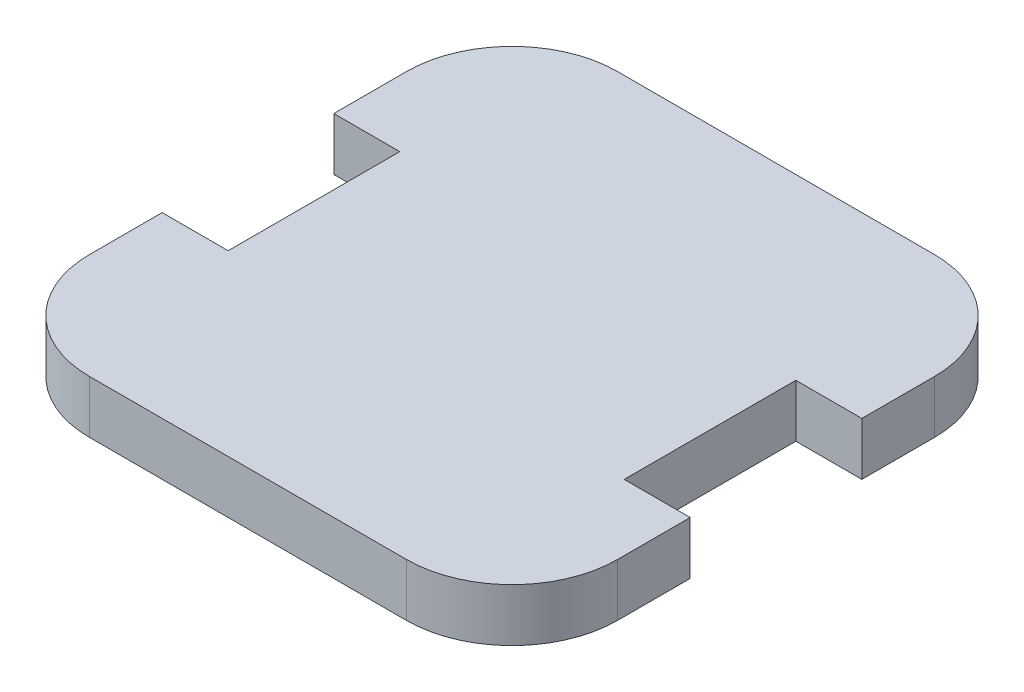
ISO-10303-21;
HEADER;
FILE_DESCRIPTION(('STEP AP214'),'2;1');
FILE_NAME('part.step','',(''),(''),'','','');
FILE_SCHEMA(('AUTOMOTIVE_DESIGN { 1 0 10303 214 1 1 1 1 }'));
ENDSEC;
DATA;
#1=APPLICATION_CONTEXT('core data for automotive mechanical design processes');
#2=APPLICATION_PROTOCOL_DEFINITION('international standard','automotive_design',2000,#1);
#3=PRODUCT_CONTEXT('',#1,'mechanical');
#4=PRODUCT('Part','Part','',(#3));
#5=PRODUCT_RELATED_PRODUCT_CATEGORY('part','',(#4));
#6=PRODUCT_DEFINITION_FORMATION('','',#4);
#7=PRODUCT_DEFINITION_CONTEXT('part definition',#1,'design');
#8=PRODUCT_DEFINITION('design','',#6,#7);
#9=PRODUCT_DEFINITION_SHAPE('','',#8);
#10=(LENGTH_UNIT() NAMED_UNIT(*) SI_UNIT(.MILLI.,.METRE.));
#11=(NAMED_UNIT(*) PLANE_ANGLE_UNIT() SI_UNIT($,.RADIAN.));
#12=(NAMED_UNIT(*) SI_UNIT($,.STERADIAN.) SOLID_ANGLE_UNIT());
#13=UNCERTAINTY_MEASURE_WITH_UNIT(LENGTH_MEASURE(1.E-05),#10,'distance_accuracy_value','');
#14=(GEOMETRIC_REPRESENTATION_CONTEXT(3) GLOBAL_UNCERTAINTY_ASSIGNED_CONTEXT((#13)) GLOBAL_UNIT_ASSIGNED_CONTEXT((#10,
#11,#12)) REPRESENTATION_CONTEXT('',''));
#15=CARTESIAN_POINT('',(0.,0.,0.));
#16=DIRECTION('',(0.,0.,1.));
#17=DIRECTION('',(1.,0.,0.));
#18=AXIS2_PLACEMENT_3D('',#15,#16,#17);
#19=CARTESIAN_POINT('',(-25.4,5.08,25.4));
#20=DIRECTION('',(1.,0.,0.));
#21=DIRECTION('',(0.,0.,-1.));
#22=AXIS2_PLACEMENT_3D('',#19,#20,#21);
#23=PLANE('',#22);
#24=DIRECTION('',(0.,1.,0.));
#25=VECTOR('',#24,1.);
#26=CARTESIAN_POINT('',(-25.4,0.,-8.255));
#27=LINE('',#26,#25);
#28=CARTESIAN_POINT('',(-25.4,0.,-8.255));
#29=VERTEX_POINT('',#28);
#30=CARTESIAN_POINT('',(-25.4,5.08,-8.255));
#31=VERTEX_POINT('',#30);
#32=EDGE_CURVE('E236',#29,#31,#27,.T.);
#33=ORIENTED_EDGE('',*,*,#32,.T.);
#34=DIRECTION('',(0.,0.,1.));
#35=VECTOR('',#34,1.);
#36=CARTESIAN_POINT('',(-25.4,5.08,25.4));
#37=LINE('',#36,#35);
#38=CARTESIAN_POINT('',(-25.4,5.08,-15.24));
#39=VERTEX_POINT('',#38);
#40=EDGE_CURVE('E219',#39,#31,#37,.T.);
#41=ORIENTED_EDGE('',*,*,#40,.F.);
#42=DIRECTION('',(0.,-1.,0.));
#43=VECTOR('',#42,1.);
#44=CARTESIAN_POINT('',(-25.4,5.08,-15.24));
#45=LINE('',#44,#43);
#46=CARTESIAN_POINT('',(-25.4,0.,-15.24));
#47=VERTEX_POINT('',#46);
#48=EDGE_CURVE('E41',#39,#47,#45,.T.);
#49=ORIENTED_EDGE('',*,*,#48,.T.);
#50=DIRECTION('',(0.,0.,1.));
#51=VECTOR('',#50,1.);
#52=CARTESIAN_POINT('',(-25.4,0.,25.4));
#53=LINE('',#52,#51);
#54=EDGE_CURVE('E167',#47,#29,#53,.T.);
#55=ORIENTED_EDGE('',*,*,#54,.T.);
#56=EDGE_LOOP('',(#33,#41,#49,#55));
#57=FACE_BOUND('',#56,.T.);
#58=ADVANCED_FACE('F33',(#57),#23,.F.);
#59=DIRECTION('',(0.,1.,0.));
#60=VECTOR('',#59,1.);
#61=CARTESIAN_POINT('',(-25.4,0.,8.255));
#62=LINE('',#61,#60);
#63=CARTESIAN_POINT('',(-25.4,0.,8.255));
#64=VERTEX_POINT('',#63);
#65=CARTESIAN_POINT('',(-25.4,5.08,8.255));
#66=VERTEX_POINT('',#65);
#67=EDGE_CURVE('E147',#64,#66,#62,.T.);
#68=ORIENTED_EDGE('',*,*,#67,.F.);
#69=CARTESIAN_POINT('',(-25.4,0.,15.24));
#70=VERTEX_POINT('',#69);
#71=EDGE_CURVE('E158',#64,#70,#53,.T.);
#72=ORIENTED_EDGE('',*,*,#71,.T.);
#73=DIRECTION('',(0.,-1.,0.));
#74=VECTOR('',#73,1.);
#75=CARTESIAN_POINT('',(-25.4,5.08,15.24));
#76=LINE('',#75,#74);
#77=CARTESIAN_POINT('',(-25.4,5.08,15.24));
#78=VERTEX_POINT('',#77);
#79=EDGE_CURVE('E11',#70,#78,#76,.F.);
#80=ORIENTED_EDGE('',*,*,#79,.T.);
#81=EDGE_CURVE('E160',#66,#78,#37,.T.);
#82=ORIENTED_EDGE('',*,*,#81,.F.);
#83=EDGE_LOOP('',(#68,#72,#80,#82));
#84=FACE_BOUND('',#83,.T.);
#85=ADVANCED_FACE('F157',(#84),#23,.F.);
#86=CARTESIAN_POINT('',(0.,5.08,0.));
#87=DIRECTION('',(0.,-1.,0.));
#88=DIRECTION('',(0.,0.,-1.));
#89=AXIS2_PLACEMENT_3D('',#86,#87,#88);
#90=PLANE('',#89);
#91=DIRECTION('',(1.,0.,0.));
#92=VECTOR('',#91,1.);
#93=CARTESIAN_POINT('',(-19.05,5.08,-8.255));
#94=LINE('',#93,#92);
#95=CARTESIAN_POINT('',(-19.05,5.08,-8.255));
#96=VERTEX_POINT('',#95);
#97=EDGE_CURVE('E153',#31,#96,#94,.T.);
#98=ORIENTED_EDGE('',*,*,#97,.T.);
#99=DIRECTION('',(0.,0.,1.));
#100=VECTOR('',#99,1.);
#101=CARTESIAN_POINT('',(-19.05,5.08,8.255));
#102=LINE('',#101,#100);
#103=CARTESIAN_POINT('',(-19.05,5.08,8.255));
#104=VERTEX_POINT('',#103);
#105=EDGE_CURVE('E231',#96,#104,#102,.T.);
#106=ORIENTED_EDGE('',*,*,#105,.T.);
#107=DIRECTION('',(-1.,0.,0.));
#108=VECTOR('',#107,1.);
#109=CARTESIAN_POINT('',(-19.05,5.08,8.255));
#110=LINE('',#109,#108);
#111=EDGE_CURVE('E229',#104,#66,#110,.T.);
#112=ORIENTED_EDGE('',*,*,#111,.T.);
#113=ORIENTED_EDGE('',*,*,#81,.T.);
#114=CARTESIAN_POINT('',(-15.24,5.08,15.24));
#115=DIRECTION('',(0.,-1.,0.));
#116=DIRECTION('',(0.,0.,-1.));
#117=AXIS2_PLACEMENT_3D('',#114,#115,#116);
#118=CIRCLE('',#117,10.16);
#119=CARTESIAN_POINT('',(-15.24,5.08,25.4));
#120=VERTEX_POINT('',#119);
#121=EDGE_CURVE('E202',#78,#120,#118,.F.);
#122=ORIENTED_EDGE('',*,*,#121,.T.);
#123=DIRECTION('',(1.,0.,0.));
#124=VECTOR('',#123,1.);
#125=CARTESIAN_POINT('',(-25.4,5.08,25.4));
#126=LINE('',#125,#124);
#127=CARTESIAN_POINT('',(15.24,5.08,25.4));
#128=VERTEX_POINT('',#127);
#129=EDGE_CURVE('E183',#120,#128,#126,.T.);
#130=ORIENTED_EDGE('',*,*,#129,.T.);
#131=CARTESIAN_POINT('',(15.24,5.08,15.24));
#132=DIRECTION('',(0.,-1.,0.));
#133=DIRECTION('',(0.,0.,-1.));
#134=AXIS2_PLACEMENT_3D('',#131,#132,#133);
#135=CIRCLE('',#134,10.16);
#136=CARTESIAN_POINT('',(25.4,5.08,15.24));
#137=VERTEX_POINT('',#136);
#138=EDGE_CURVE('E204',#128,#137,#135,.F.);
#139=ORIENTED_EDGE('',*,*,#138,.T.);
#140=DIRECTION('',(0.,0.,-1.));
#141=VECTOR('',#140,1.);
#142=CARTESIAN_POINT('',(25.4,5.08,25.4));
#143=LINE('',#142,#141);
#144=CARTESIAN_POINT('',(25.4,5.08,8.255));
#145=VERTEX_POINT('',#144);
#146=EDGE_CURVE('E266',#137,#145,#143,.T.);
#147=ORIENTED_EDGE('',*,*,#146,.T.);
#148=DIRECTION('',(1.,0.,0.));
#149=VECTOR('',#148,1.);
#150=CARTESIAN_POINT('',(19.05,5.08,8.255));
#151=LINE('',#150,#149);
#152=CARTESIAN_POINT('',(19.05,5.08,8.255));
#153=VERTEX_POINT('',#152);
#154=EDGE_CURVE('E245',#153,#145,#151,.T.);
#155=ORIENTED_EDGE('',*,*,#154,.F.);
#156=DIRECTION('',(0.,0.,1.));
#157=VECTOR('',#156,1.);
#158=CARTESIAN_POINT('',(19.05,5.08,8.255));
#159=LINE('',#158,#157);
#160=CARTESIAN_POINT('',(19.05,5.08,-8.255));
#161=VERTEX_POINT('',#160);
#162=EDGE_CURVE('E253',#161,#153,#159,.T.);
#163=ORIENTED_EDGE('',*,*,#162,.F.);
#164=DIRECTION('',(-1.,0.,0.));
#165=VECTOR('',#164,1.);
#166=CARTESIAN_POINT('',(19.05,5.08,-8.255));
#167=LINE('',#166,#165);
#168=CARTESIAN_POINT('',(25.4,5.08,-8.255));
#169=VERTEX_POINT('',#168);
#170=EDGE_CURVE('E238',#169,#161,#167,.T.);
#171=ORIENTED_EDGE('',*,*,#170,.F.);
#172=CARTESIAN_POINT('',(25.4,5.08,-15.24));
#173=VERTEX_POINT('',#172);
#174=EDGE_CURVE('E179',#169,#173,#143,.T.);
#175=ORIENTED_EDGE('',*,*,#174,.T.);
#176=CARTESIAN_POINT('',(15.24,5.08,-15.24));
#177=DIRECTION('',(0.,-1.,0.));
#178=DIRECTION('',(0.,0.,-1.));
#179=AXIS2_PLACEMENT_3D('',#176,#177,#178);
#180=CIRCLE('',#179,10.16);
#181=CARTESIAN_POINT('',(15.24,5.08,-25.4));
#182=VERTEX_POINT('',#181);
#183=EDGE_CURVE('E206',#173,#182,#180,.F.);
#184=ORIENTED_EDGE('',*,*,#183,.T.);
#185=DIRECTION('',(-1.,0.,0.));
#186=VECTOR('',#185,1.);
#187=CARTESIAN_POINT('',(-25.4,5.08,-25.4));
#188=LINE('',#187,#186);
#189=CARTESIAN_POINT('',(-15.24,5.08,-25.4));
#190=VERTEX_POINT('',#189);
#191=EDGE_CURVE('E269',#182,#190,#188,.T.);
#192=ORIENTED_EDGE('',*,*,#191,.T.);
#193=CARTESIAN_POINT('',(-15.24,5.08,-15.24));
#194=DIRECTION('',(0.,-1.,0.));
#195=DIRECTION('',(0.,0.,-1.));
#196=AXIS2_PLACEMENT_3D('',#193,#194,#195);
#197=CIRCLE('',#196,10.16);
#198=EDGE_CURVE('E200',#190,#39,#197,.F.);
#199=ORIENTED_EDGE('',*,*,#198,.T.);
#200=ORIENTED_EDGE('',*,*,#40,.T.);
#201=EDGE_LOOP('',(#98,#106,#112,#113,#122,#130,#139,#147,#155,#163,#171,#175,#184,#192,#199,#200));
#202=FACE_BOUND('',#201,.T.);
#203=ADVANCED_FACE('F289',(#202),#90,.F.);
#204=CARTESIAN_POINT('',(0.,0.,0.));
#205=DIRECTION('',(0.,-1.,0.));
#206=DIRECTION('',(0.,0.,-1.));
#207=AXIS2_PLACEMENT_3D('',#204,#205,#206);
#208=PLANE('',#207);
#209=DIRECTION('',(0.,0.,1.));
#210=VECTOR('',#209,1.);
#211=CARTESIAN_POINT('',(-19.05,0.,8.255));
#212=LINE('',#211,#210);
#213=CARTESIAN_POINT('',(-19.05,0.,-8.255));
#214=VERTEX_POINT('',#213);
#215=CARTESIAN_POINT('',(-19.05,0.,8.255));
#216=VERTEX_POINT('',#215);
#217=EDGE_CURVE('E152',#214,#216,#212,.T.);
#218=ORIENTED_EDGE('',*,*,#217,.F.);
#219=DIRECTION('',(1.,0.,0.));
#220=VECTOR('',#219,1.);
#221=CARTESIAN_POINT('',(-19.05,0.,-8.255));
#222=LINE('',#221,#220);
#223=EDGE_CURVE('E161',#29,#214,#222,.T.);
#224=ORIENTED_EDGE('',*,*,#223,.F.);
#225=ORIENTED_EDGE('',*,*,#54,.F.);
#226=CARTESIAN_POINT('',(-15.24,0.,-15.24));
#227=DIRECTION('',(0.,-1.,0.));
#228=DIRECTION('',(0.,0.,-1.));
#229=AXIS2_PLACEMENT_3D('',#226,#227,#228);
#230=CIRCLE('',#229,10.16);
#231=CARTESIAN_POINT('',(-15.24,0.,-25.4));
#232=VERTEX_POINT('',#231);
#233=EDGE_CURVE('E186',#47,#232,#230,.T.);
#234=ORIENTED_EDGE('',*,*,#233,.T.);
#235=DIRECTION('',(-1.,0.,0.));
#236=VECTOR('',#235,1.);
#237=CARTESIAN_POINT('',(-25.4,0.,-25.4));
#238=LINE('',#237,#236);
#239=CARTESIAN_POINT('',(15.24,0.,-25.4));
#240=VERTEX_POINT('',#239);
#241=EDGE_CURVE('E168',#240,#232,#238,.T.);
#242=ORIENTED_EDGE('',*,*,#241,.F.);
#243=CARTESIAN_POINT('',(15.24,0.,-15.24));
#244=DIRECTION('',(0.,-1.,0.));
#245=DIRECTION('',(0.,0.,-1.));
#246=AXIS2_PLACEMENT_3D('',#243,#244,#245);
#247=CIRCLE('',#246,10.16);
#248=CARTESIAN_POINT('',(25.4,0.,-15.24));
#249=VERTEX_POINT('',#248);
#250=EDGE_CURVE('E191',#240,#249,#247,.T.);
#251=ORIENTED_EDGE('',*,*,#250,.T.);
#252=DIRECTION('',(0.,0.,-1.));
#253=VECTOR('',#252,1.);
#254=CARTESIAN_POINT('',(25.4,0.,25.4));
#255=LINE('',#254,#253);
#256=CARTESIAN_POINT('',(25.4,0.,-8.255));
#257=VERTEX_POINT('',#256);
#258=EDGE_CURVE('E260',#257,#249,#255,.T.);
#259=ORIENTED_EDGE('',*,*,#258,.F.);
#260=DIRECTION('',(-1.,0.,0.));
#261=VECTOR('',#260,1.);
#262=CARTESIAN_POINT('',(19.05,0.,-8.255));
#263=LINE('',#262,#261);
#264=CARTESIAN_POINT('',(19.05,0.,-8.255));
#265=VERTEX_POINT('',#264);
#266=EDGE_CURVE('E242',#257,#265,#263,.T.);
#267=ORIENTED_EDGE('',*,*,#266,.T.);
#268=DIRECTION('',(0.,0.,1.));
#269=VECTOR('',#268,1.);
#270=CARTESIAN_POINT('',(19.05,0.,8.255));
#271=LINE('',#270,#269);
#272=CARTESIAN_POINT('',(19.05,0.,8.255));
#273=VERTEX_POINT('',#272);
#274=EDGE_CURVE('E56',#265,#273,#271,.T.);
#275=ORIENTED_EDGE('',*,*,#274,.T.);
#276=DIRECTION('',(1.,0.,0.));
#277=VECTOR('',#276,1.);
#278=CARTESIAN_POINT('',(19.05,0.,8.255));
#279=LINE('',#278,#277);
#280=CARTESIAN_POINT('',(25.4,0.,8.255));
#281=VERTEX_POINT('',#280);
#282=EDGE_CURVE('E247',#273,#281,#279,.T.);
#283=ORIENTED_EDGE('',*,*,#282,.T.);
#284=CARTESIAN_POINT('',(25.4,0.,15.24));
#285=VERTEX_POINT('',#284);
#286=EDGE_CURVE('E173',#285,#281,#255,.T.);
#287=ORIENTED_EDGE('',*,*,#286,.F.);
#288=CARTESIAN_POINT('',(15.24,0.,15.24));
#289=DIRECTION('',(0.,-1.,0.));
#290=DIRECTION('',(0.,0.,-1.));
#291=AXIS2_PLACEMENT_3D('',#288,#289,#290);
#292=CIRCLE('',#291,10.16);
#293=CARTESIAN_POINT('',(15.24,0.,25.4));
#294=VERTEX_POINT('',#293);
#295=EDGE_CURVE('E189',#285,#294,#292,.T.);
#296=ORIENTED_EDGE('',*,*,#295,.T.);
#297=DIRECTION('',(1.,0.,0.));
#298=VECTOR('',#297,1.);
#299=CARTESIAN_POINT('',(-25.4,0.,25.4));
#300=LINE('',#299,#298);
#301=CARTESIAN_POINT('',(-15.24,0.,25.4));
#302=VERTEX_POINT('',#301);
#303=EDGE_CURVE('E171',#302,#294,#300,.T.);
#304=ORIENTED_EDGE('',*,*,#303,.F.);
#305=CARTESIAN_POINT('',(-15.24,0.,15.24));
#306=DIRECTION('',(0.,-1.,0.));
#307=DIRECTION('',(0.,0.,-1.));
#308=AXIS2_PLACEMENT_3D('',#305,#306,#307);
#309=CIRCLE('',#308,10.16);
#310=EDGE_CURVE('E165',#302,#70,#309,.T.);
#311=ORIENTED_EDGE('',*,*,#310,.T.);
#312=ORIENTED_EDGE('',*,*,#71,.F.);
#313=DIRECTION('',(-1.,0.,0.));
#314=VECTOR('',#313,1.);
#315=CARTESIAN_POINT('',(-19.05,0.,8.255));
#316=LINE('',#315,#314);
#317=EDGE_CURVE('E144',#216,#64,#316,.T.);
#318=ORIENTED_EDGE('',*,*,#317,.F.);
#319=EDGE_LOOP('',(#218,#224,#225,#234,#242,#251,#259,#267,#275,#283,#287,#296,#304,#311,#312,#318));
#320=FACE_BOUND('',#319,.T.);
#321=ADVANCED_FACE('F163',(#320),#208,.T.);
#322=CARTESIAN_POINT('',(25.4,5.08,25.4));
#323=DIRECTION('',(-1.,0.,0.));
#324=DIRECTION('',(0.,0.,1.));
#325=AXIS2_PLACEMENT_3D('',#322,#323,#324);
#326=PLANE('',#325);
#327=ORIENTED_EDGE('',*,*,#286,.T.);
#328=DIRECTION('',(0.,1.,0.));
#329=VECTOR('',#328,1.);
#330=CARTESIAN_POINT('',(25.4,0.,8.255));
#331=LINE('',#330,#329);
#332=EDGE_CURVE('E257',#281,#145,#331,.T.);
#333=ORIENTED_EDGE('',*,*,#332,.T.);
#334=ORIENTED_EDGE('',*,*,#146,.F.);
#335=DIRECTION('',(0.,-1.,0.));
#336=VECTOR('',#335,1.);
#337=CARTESIAN_POINT('',(25.4,5.08,15.24));
#338=LINE('',#337,#336);
#339=EDGE_CURVE('E194',#137,#285,#338,.T.);
#340=ORIENTED_EDGE('',*,*,#339,.T.);
#341=EDGE_LOOP('',(#327,#333,#334,#340));
#342=FACE_BOUND('',#341,.T.);
#343=ADVANCED_FACE('F311',(#342),#326,.F.);
#344=ORIENTED_EDGE('',*,*,#174,.F.);
#345=DIRECTION('',(0.,1.,0.));
#346=VECTOR('',#345,1.);
#347=CARTESIAN_POINT('',(25.4,0.,-8.255));
#348=LINE('',#347,#346);
#349=EDGE_CURVE('E250',#257,#169,#348,.T.);
#350=ORIENTED_EDGE('',*,*,#349,.F.);
#351=ORIENTED_EDGE('',*,*,#258,.T.);
#352=DIRECTION('',(0.,-1.,0.));
#353=VECTOR('',#352,1.);
#354=CARTESIAN_POINT('',(25.4,5.08,-15.24));
#355=LINE('',#354,#353);
#356=EDGE_CURVE('E197',#249,#173,#355,.F.);
#357=ORIENTED_EDGE('',*,*,#356,.T.);
#358=EDGE_LOOP('',(#344,#350,#351,#357));
#359=FACE_BOUND('',#358,.T.);
#360=ADVANCED_FACE('F281',(#359),#326,.F.);
#361=CARTESIAN_POINT('',(-25.4,5.08,-25.4));
#362=DIRECTION('',(0.,0.,1.));
#363=DIRECTION('',(1.,0.,0.));
#364=AXIS2_PLACEMENT_3D('',#361,#362,#363);
#365=PLANE('',#364);
#366=ORIENTED_EDGE('',*,*,#191,.F.);
#367=DIRECTION('',(0.,-1.,0.));
#368=VECTOR('',#367,1.);
#369=CARTESIAN_POINT('',(15.24,5.08,-25.4));
#370=LINE('',#369,#368);
#371=EDGE_CURVE('E182',#182,#240,#370,.T.);
#372=ORIENTED_EDGE('',*,*,#371,.T.);
#373=ORIENTED_EDGE('',*,*,#241,.T.);
#374=DIRECTION('',(0.,-1.,0.));
#375=VECTOR('',#374,1.);
#376=CARTESIAN_POINT('',(-15.24,5.08,-25.4));
#377=LINE('',#376,#375);
#378=EDGE_CURVE('E180',#232,#190,#377,.F.);
#379=ORIENTED_EDGE('',*,*,#378,.T.);
#380=EDGE_LOOP('',(#366,#372,#373,#379));
#381=FACE_BOUND('',#380,.T.);
#382=ADVANCED_FACE('F292',(#381),#365,.F.);
#383=CARTESIAN_POINT('',(-25.4,5.08,25.4));
#384=DIRECTION('',(0.,0.,-1.));
#385=DIRECTION('',(-1.,0.,0.));
#386=AXIS2_PLACEMENT_3D('',#383,#384,#385);
#387=PLANE('',#386);
#388=ORIENTED_EDGE('',*,*,#303,.T.);
#389=DIRECTION('',(0.,-1.,0.));
#390=VECTOR('',#389,1.);
#391=CARTESIAN_POINT('',(15.24,5.08,25.4));
#392=LINE('',#391,#390);
#393=EDGE_CURVE('E211',#294,#128,#392,.F.);
#394=ORIENTED_EDGE('',*,*,#393,.T.);
#395=ORIENTED_EDGE('',*,*,#129,.F.);
#396=DIRECTION('',(0.,-1.,0.));
#397=VECTOR('',#396,1.);
#398=CARTESIAN_POINT('',(-15.24,5.08,25.4));
#399=LINE('',#398,#397);
#400=EDGE_CURVE('E208',#120,#302,#399,.T.);
#401=ORIENTED_EDGE('',*,*,#400,.T.);
#402=EDGE_LOOP('',(#388,#394,#395,#401));
#403=FACE_BOUND('',#402,.T.);
#404=ADVANCED_FACE('F304',(#403),#387,.F.);
#405=CARTESIAN_POINT('',(15.24,5.08,-15.24));
#406=DIRECTION('',(0.,-1.,0.));
#407=DIRECTION('',(0.,0.,-1.));
#408=AXIS2_PLACEMENT_3D('',#405,#406,#407);
#409=CYLINDRICAL_SURFACE('',#408,10.16);
#410=ORIENTED_EDGE('',*,*,#183,.F.);
#411=ORIENTED_EDGE('',*,*,#356,.F.);
#412=ORIENTED_EDGE('',*,*,#250,.F.);
#413=ORIENTED_EDGE('',*,*,#371,.F.);
#414=EDGE_LOOP('',(#410,#411,#412,#413));
#415=FACE_BOUND('',#414,.T.);
#416=ADVANCED_FACE('F286',(#415),#409,.T.);
#417=CARTESIAN_POINT('',(15.24,5.08,15.24));
#418=DIRECTION('',(0.,-1.,0.));
#419=DIRECTION('',(0.,0.,-1.));
#420=AXIS2_PLACEMENT_3D('',#417,#418,#419);
#421=CYLINDRICAL_SURFACE('',#420,10.16);
#422=ORIENTED_EDGE('',*,*,#138,.F.);
#423=ORIENTED_EDGE('',*,*,#393,.F.);
#424=ORIENTED_EDGE('',*,*,#295,.F.);
#425=ORIENTED_EDGE('',*,*,#339,.F.);
#426=EDGE_LOOP('',(#422,#423,#424,#425));
#427=FACE_BOUND('',#426,.T.);
#428=ADVANCED_FACE('F309',(#427),#421,.T.);
#429=CARTESIAN_POINT('',(-15.24,5.08,15.24));
#430=DIRECTION('',(0.,-1.,0.));
#431=DIRECTION('',(0.,0.,-1.));
#432=AXIS2_PLACEMENT_3D('',#429,#430,#431);
#433=CYLINDRICAL_SURFACE('',#432,10.16);
#434=ORIENTED_EDGE('',*,*,#121,.F.);
#435=ORIENTED_EDGE('',*,*,#79,.F.);
#436=ORIENTED_EDGE('',*,*,#310,.F.);
#437=ORIENTED_EDGE('',*,*,#400,.F.);
#438=EDGE_LOOP('',(#434,#435,#436,#437));
#439=FACE_BOUND('',#438,.T.);
#440=ADVANCED_FACE('F302',(#439),#433,.T.);
#441=CARTESIAN_POINT('',(-15.24,5.08,-15.24));
#442=DIRECTION('',(0.,-1.,0.));
#443=DIRECTION('',(0.,0.,-1.));
#444=AXIS2_PLACEMENT_3D('',#441,#442,#443);
#445=CYLINDRICAL_SURFACE('',#444,10.16);
#446=ORIENTED_EDGE('',*,*,#198,.F.);
#447=ORIENTED_EDGE('',*,*,#378,.F.);
#448=ORIENTED_EDGE('',*,*,#233,.F.);
#449=ORIENTED_EDGE('',*,*,#48,.F.);
#450=EDGE_LOOP('',(#446,#447,#448,#449));
#451=FACE_BOUND('',#450,.T.);
#452=ADVANCED_FACE('F35',(#451),#445,.T.);
#453=CARTESIAN_POINT('',(19.05,0.,8.255));
#454=DIRECTION('',(0.,0.,1.));
#455=DIRECTION('',(1.,0.,0.));
#456=AXIS2_PLACEMENT_3D('',#453,#454,#455);
#457=PLANE('',#456);
#458=ORIENTED_EDGE('',*,*,#154,.T.);
#459=ORIENTED_EDGE('',*,*,#332,.F.);
#460=ORIENTED_EDGE('',*,*,#282,.F.);
#461=DIRECTION('',(0.,1.,0.));
#462=VECTOR('',#461,1.);
#463=CARTESIAN_POINT('',(19.05,0.,8.255));
#464=LINE('',#463,#462);
#465=EDGE_CURVE('E261',#273,#153,#464,.T.);
#466=ORIENTED_EDGE('',*,*,#465,.T.);
#467=EDGE_LOOP('',(#458,#459,#460,#466));
#468=FACE_BOUND('',#467,.T.);
#469=ADVANCED_FACE('F315',(#468),#457,.F.);
#470=CARTESIAN_POINT('',(19.05,0.,8.255));
#471=DIRECTION('',(-1.,0.,0.));
#472=DIRECTION('',(0.,0.,1.));
#473=AXIS2_PLACEMENT_3D('',#470,#471,#472);
#474=PLANE('',#473);
#475=ORIENTED_EDGE('',*,*,#162,.T.);
#476=ORIENTED_EDGE('',*,*,#465,.F.);
#477=ORIENTED_EDGE('',*,*,#274,.F.);
#478=DIRECTION('',(0.,1.,0.));
#479=VECTOR('',#478,1.);
#480=CARTESIAN_POINT('',(19.05,0.,-8.255));
#481=LINE('',#480,#479);
#482=EDGE_CURVE('E263',#265,#161,#481,.T.);
#483=ORIENTED_EDGE('',*,*,#482,.T.);
#484=EDGE_LOOP('',(#475,#476,#477,#483));
#485=FACE_BOUND('',#484,.T.);
#486=ADVANCED_FACE('F317',(#485),#474,.F.);
#487=CARTESIAN_POINT('',(19.05,0.,-8.255));
#488=DIRECTION('',(0.,0.,-1.));
#489=DIRECTION('',(-1.,0.,0.));
#490=AXIS2_PLACEMENT_3D('',#487,#488,#489);
#491=PLANE('',#490);
#492=ORIENTED_EDGE('',*,*,#170,.T.);
#493=ORIENTED_EDGE('',*,*,#482,.F.);
#494=ORIENTED_EDGE('',*,*,#266,.F.);
#495=ORIENTED_EDGE('',*,*,#349,.T.);
#496=EDGE_LOOP('',(#492,#493,#494,#495));
#497=FACE_BOUND('',#496,.T.);
#498=ADVANCED_FACE('F319',(#497),#491,.F.);
#499=CARTESIAN_POINT('',(-19.05,0.,-8.255));
#500=DIRECTION('',(0.,0.,1.));
#501=DIRECTION('',(1.,0.,0.));
#502=AXIS2_PLACEMENT_3D('',#499,#500,#501);
#503=PLANE('',#502);
#504=ORIENTED_EDGE('',*,*,#97,.F.);
#505=ORIENTED_EDGE('',*,*,#32,.F.);
#506=ORIENTED_EDGE('',*,*,#223,.T.);
#507=DIRECTION('',(0.,1.,0.));
#508=VECTOR('',#507,1.);
#509=CARTESIAN_POINT('',(-19.05,0.,-8.255));
#510=LINE('',#509,#508);
#511=EDGE_CURVE('E239',#214,#96,#510,.T.);
#512=ORIENTED_EDGE('',*,*,#511,.T.);
#513=EDGE_LOOP('',(#504,#505,#506,#512));
#514=FACE_BOUND('',#513,.T.);
#515=ADVANCED_FACE('F295',(#514),#503,.T.);
#516=CARTESIAN_POINT('',(-19.05,0.,8.255));
#517=DIRECTION('',(-1.,0.,0.));
#518=DIRECTION('',(0.,0.,1.));
#519=AXIS2_PLACEMENT_3D('',#516,#517,#518);
#520=PLANE('',#519);
#521=ORIENTED_EDGE('',*,*,#105,.F.);
#522=ORIENTED_EDGE('',*,*,#511,.F.);
#523=ORIENTED_EDGE('',*,*,#217,.T.);
#524=DIRECTION('',(0.,1.,0.));
#525=VECTOR('',#524,1.);
#526=CARTESIAN_POINT('',(-19.05,0.,8.255));
#527=LINE('',#526,#525);
#528=EDGE_CURVE('E48',#216,#104,#527,.T.);
#529=ORIENTED_EDGE('',*,*,#528,.T.);
#530=EDGE_LOOP('',(#521,#522,#523,#529));
#531=FACE_BOUND('',#530,.T.);
#532=ADVANCED_FACE('F297',(#531),#520,.T.);
#533=CARTESIAN_POINT('',(-19.05,0.,8.255));
#534=DIRECTION('',(0.,0.,-1.));
#535=DIRECTION('',(-1.,0.,0.));
#536=AXIS2_PLACEMENT_3D('',#533,#534,#535);
#537=PLANE('',#536);
#538=ORIENTED_EDGE('',*,*,#111,.F.);
#539=ORIENTED_EDGE('',*,*,#528,.F.);
#540=ORIENTED_EDGE('',*,*,#317,.T.);
#541=ORIENTED_EDGE('',*,*,#67,.T.);
#542=EDGE_LOOP('',(#538,#539,#540,#541));
#543=FACE_BOUND('',#542,.T.);
#544=ADVANCED_FACE('F146',(#543),#537,.T.);
#545=CLOSED_SHELL('',(#58,#85,#203,#321,#343,#360,#382,#404,#416,#428,#440,#452,#469,#486,#498,
#515,#532,#544));
#546=MANIFOLD_SOLID_BREP('B2',#545);
#547=ADVANCED_BREP_SHAPE_REPRESENTATION('',(#18,#546),#14);
#548=SHAPE_DEFINITION_REPRESENTATION(#9,#547);
ENDSEC;
END-ISO-10303-21;
